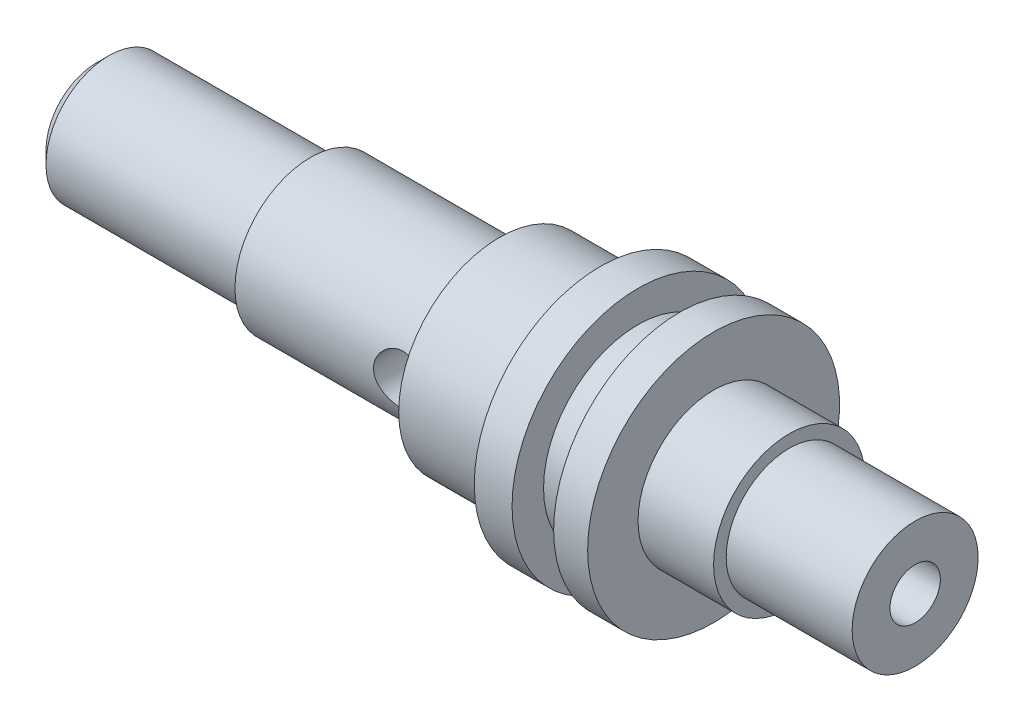
ISO-10303-21;
HEADER;
FILE_DESCRIPTION(('STEP AP214'),'2;1');
FILE_NAME('part.step','',(''),(''),'','','');
FILE_SCHEMA(('AUTOMOTIVE_DESIGN { 1 0 10303 214 1 1 1 1 }'));
ENDSEC;
DATA;
#1=APPLICATION_CONTEXT('core data for automotive mechanical design processes');
#2=APPLICATION_PROTOCOL_DEFINITION('international standard','automotive_design',2000,#1);
#3=PRODUCT_CONTEXT('',#1,'mechanical');
#4=PRODUCT('Part','Part','',(#3));
#5=PRODUCT_RELATED_PRODUCT_CATEGORY('part','',(#4));
#6=PRODUCT_DEFINITION_FORMATION('','',#4);
#7=PRODUCT_DEFINITION_CONTEXT('part definition',#1,'design');
#8=PRODUCT_DEFINITION('design','',#6,#7);
#9=PRODUCT_DEFINITION_SHAPE('','',#8);
#10=(LENGTH_UNIT() NAMED_UNIT(*) SI_UNIT(.MILLI.,.METRE.));
#11=(NAMED_UNIT(*) PLANE_ANGLE_UNIT() SI_UNIT($,.RADIAN.));
#12=(NAMED_UNIT(*) SI_UNIT($,.STERADIAN.) SOLID_ANGLE_UNIT());
#13=UNCERTAINTY_MEASURE_WITH_UNIT(LENGTH_MEASURE(1.E-05),#10,'distance_accuracy_value','');
#14=(GEOMETRIC_REPRESENTATION_CONTEXT(3) GLOBAL_UNCERTAINTY_ASSIGNED_CONTEXT((#13)) GLOBAL_UNIT_ASSIGNED_CONTEXT((#10,
#11,#12)) REPRESENTATION_CONTEXT('',''));
#15=CARTESIAN_POINT('',(0.,0.,0.));
#16=DIRECTION('',(0.,0.,1.));
#17=DIRECTION('',(1.,0.,0.));
#18=AXIS2_PLACEMENT_3D('',#15,#16,#17);
#19=CARTESIAN_POINT('',(0.,0.,0.));
#20=DIRECTION('',(1.,0.,0.));
#21=DIRECTION('',(0.,0.,-1.00000000000001));
#22=AXIS2_PLACEMENT_3D('',#19,#20,#21);
#23=PLANE('',#22);
#24=CARTESIAN_POINT('',(0.,0.,0.));
#25=DIRECTION('',(1.,0.,0.));
#26=DIRECTION('',(0.,0.,-1.00000000000001));
#27=AXIS2_PLACEMENT_3D('',#24,#25,#26);
#28=CIRCLE('',#27,4.);
#29=CARTESIAN_POINT('',(0.,0.,-4.00000000000003));
#30=VERTEX_POINT('',#29);
#31=EDGE_CURVE('E58',#30,#30,#28,.F.);
#32=ORIENTED_EDGE('',*,*,#31,.T.);
#33=EDGE_LOOP('',(#32));
#34=FACE_BOUND('',#33,.T.);
#35=ADVANCED_FACE('F50',(#34),#23,.F.);
#36=CARTESIAN_POINT('',(0.,0.,0.));
#37=DIRECTION('',(-1.,0.,0.));
#38=DIRECTION('',(0.,0.,1.00000000000001));
#39=AXIS2_PLACEMENT_3D('',#36,#37,#38);
#40=CYLINDRICAL_SURFACE('',#39,5.);
#41=CARTESIAN_POINT('',(1.00000000000001,0.,0.));
#42=DIRECTION('',(1.,0.,0.));
#43=DIRECTION('',(0.,0.,-1.00000000000001));
#44=AXIS2_PLACEMENT_3D('',#41,#42,#43);
#45=CIRCLE('',#44,5.);
#46=CARTESIAN_POINT('',(1.00000000000001,0.,-5.00000000000004));
#47=VERTEX_POINT('',#46);
#48=EDGE_CURVE('E13',#47,#47,#45,.T.);
#49=ORIENTED_EDGE('',*,*,#48,.T.);
#50=EDGE_LOOP('',(#49));
#51=FACE_BOUND('',#50,.T.);
#52=CARTESIAN_POINT('',(17.,0.,0.));
#53=DIRECTION('',(-1.,0.,0.));
#54=DIRECTION('',(0.,0.,1.00000000000001));
#55=AXIS2_PLACEMENT_3D('',#52,#53,#54);
#56=CIRCLE('',#55,5.);
#57=CARTESIAN_POINT('',(17.,0.,5.00000000000004));
#58=VERTEX_POINT('',#57);
#59=EDGE_CURVE('E92',#58,#58,#56,.T.);
#60=ORIENTED_EDGE('',*,*,#59,.T.);
#61=EDGE_LOOP('',(#60));
#62=FACE_BOUND('',#61,.T.);
#63=ADVANCED_FACE('F113',(#51,#62),#40,.T.);
#64=CARTESIAN_POINT('',(17.,5.00000000000003,0.));
#65=DIRECTION('',(1.,0.,0.));
#66=DIRECTION('',(0.,0.,-1.00000000000001));
#67=AXIS2_PLACEMENT_3D('',#64,#65,#66);
#68=PLANE('',#67);
#69=ORIENTED_EDGE('',*,*,#59,.F.);
#70=EDGE_LOOP('',(#69));
#71=FACE_BOUND('',#70,.T.);
#72=CARTESIAN_POINT('',(17.,0.,0.));
#73=DIRECTION('',(-1.,0.,0.));
#74=DIRECTION('',(0.,0.,1.00000000000001));
#75=AXIS2_PLACEMENT_3D('',#72,#73,#74);
#76=CIRCLE('',#75,6.);
#77=CARTESIAN_POINT('',(17.,0.,6.00000000000005));
#78=VERTEX_POINT('',#77);
#79=EDGE_CURVE('E220',#78,#78,#76,.T.);
#80=ORIENTED_EDGE('',*,*,#79,.T.);
#81=EDGE_LOOP('',(#80));
#82=FACE_BOUND('',#81,.T.);
#83=ADVANCED_FACE('F117',(#71,#82),#68,.F.);
#84=CARTESIAN_POINT('',(0.,0.,0.));
#85=DIRECTION('',(-1.,0.,0.));
#86=DIRECTION('',(0.,0.,1.00000000000001));
#87=AXIS2_PLACEMENT_3D('',#84,#85,#86);
#88=CYLINDRICAL_SURFACE('',#87,6.);
#89=ORIENTED_EDGE('',*,*,#79,.F.);
#90=EDGE_LOOP('',(#89));
#91=FACE_BOUND('',#90,.T.);
#92=CARTESIAN_POINT('',(32.,0.,0.));
#93=DIRECTION('',(-1.,0.,0.));
#94=DIRECTION('',(0.,0.,1.00000000000001));
#95=AXIS2_PLACEMENT_3D('',#92,#93,#94);
#96=CIRCLE('',#95,6.);
#97=CARTESIAN_POINT('',(32.,0.,-6.00000000000006));
#98=VERTEX_POINT('',#97);
#99=CARTESIAN_POINT('',(32.,0.,6.00000000000006));
#100=VERTEX_POINT('',#99);
#101=EDGE_CURVE('E210',#98,#100,#96,.T.);
#102=ORIENTED_EDGE('',*,*,#101,.T.);
#103=CARTESIAN_POINT('',(32.,0.,6.00000000000006));
#104=CARTESIAN_POINT('',(32.0000005074633,-0.109126725773445,6.00000030601894));
#105=CARTESIAN_POINT('',(31.9910394677456,-0.218250389077097,5.99699539015089));
#106=CARTESIAN_POINT('',(31.9555417823656,-0.433283521745945,5.98530420406561));
#107=CARTESIAN_POINT('',(31.9290033121022,-0.539192656237641,5.97661734404311));
#108=CARTESIAN_POINT('',(31.8593615132319,-0.744665579003556,5.95450615812891));
#109=CARTESIAN_POINT('',(31.8162858750815,-0.844239651772065,5.94108975461707));
#110=CARTESIAN_POINT('',(31.7149176543233,-1.03474987361065,5.91088891434683));
#111=CARTESIAN_POINT('',(31.6566220699948,-1.12568431391742,5.89410381335562));
#112=CARTESIAN_POINT('',(31.5243483902825,-1.29948335004454,5.85828188886017));
#113=CARTESIAN_POINT('',(31.449937531479,-1.38200740059662,5.83919112927571));
#114=CARTESIAN_POINT('',(31.2884656905869,-1.53366538540417,5.80120629566242));
#115=CARTESIAN_POINT('',(31.201401930143,-1.60279637097894,5.78231226581101));
#116=CARTESIAN_POINT('',(31.0140297696071,-1.72764988445573,5.74626664954551));
#117=CARTESIAN_POINT('',(30.9134125205358,-1.78292971644207,5.72918078551376));
#118=CARTESIAN_POINT('',(30.7036478110829,-1.87563774775545,5.69950610837202));
#119=CARTESIAN_POINT('',(30.5945029656745,-1.91307139477355,5.68691592321494));
#120=CARTESIAN_POINT('',(30.3746535570066,-1.96774692301834,5.66822606538757));
#121=CARTESIAN_POINT('',(30.2641255830219,-1.98562689654354,5.66192191539222));
#122=CARTESIAN_POINT('',(30.0414724916882,-2.00268224666896,5.65591313259015));
#123=CARTESIAN_POINT('',(29.9293478785816,-2.00186340320946,5.65620646045463));
#124=CARTESIAN_POINT('',(29.712126739112,-1.98203980740686,5.66318030016363));
#125=CARTESIAN_POINT('',(29.606943194162,-1.96386782633399,5.66956831735066));
#126=CARTESIAN_POINT('',(29.4012131607863,-1.91121232569884,5.68753315449102));
#127=CARTESIAN_POINT('',(29.3006672291299,-1.87672685318376,5.69911059568218));
#128=CARTESIAN_POINT('',(29.105174500817,-1.79187811612044,5.72635822262501));
#129=CARTESIAN_POINT('',(29.0103439490609,-1.74126809741453,5.74209131586234));
#130=CARTESIAN_POINT('',(28.8302581834405,-1.62577821260628,5.77585117151453));
#131=CARTESIAN_POINT('',(28.7450057461332,-1.56089422472803,5.7938785958093));
#132=CARTESIAN_POINT('',(28.5818168036784,-1.41469866536449,5.83134658335485));
#133=CARTESIAN_POINT('',(28.5044946109819,-1.33270630015263,5.85081178709685));
#134=CARTESIAN_POINT('',(28.3645374666732,-1.15667913994013,5.88813876774074));
#135=CARTESIAN_POINT('',(28.301903923671,-1.06264319132164,5.90600039076141));
#136=CARTESIAN_POINT('',(28.1926073995299,-0.863895226092548,5.93834215875593));
#137=CARTESIAN_POINT('',(28.1461090173185,-0.759086552832677,5.95278700016078));
#138=CARTESIAN_POINT('',(28.0715936520886,-0.542538166729014,5.9764113428887));
#139=CARTESIAN_POINT('',(28.0435702491531,-0.43080087630991,5.98559267309765));
#140=CARTESIAN_POINT('',(28.0078886679553,-0.208767659058613,5.99735254142887));
#141=CARTESIAN_POINT('',(27.9994003816545,-0.0986191997296962,6.00020003667456));
#142=CARTESIAN_POINT('',(28.0006653471969,0.121550139920475,5.99977805389655));
#143=CARTESIAN_POINT('',(28.0104155199597,0.231571038639303,5.99650960838731));
#144=CARTESIAN_POINT('',(28.0472238154719,0.445039732608511,5.98440049434215));
#145=CARTESIAN_POINT('',(28.073772412099,0.548585613669682,5.97572397422385));
#146=CARTESIAN_POINT('',(28.1427868889335,0.749711917159147,5.9538369366014));
#147=CARTESIAN_POINT('',(28.1852547989356,0.847291577017221,5.94062584093356));
#148=CARTESIAN_POINT('',(28.2861408636816,1.03657659278655,5.91057862574586));
#149=CARTESIAN_POINT('',(28.3449491865663,1.12805991843429,5.89365629511573));
#150=CARTESIAN_POINT('',(28.476388300027,1.30012966027117,5.85810507832524));
#151=CARTESIAN_POINT('',(28.5490233120635,1.38071273559116,5.83947567187658));
#152=CARTESIAN_POINT('',(28.7099575020132,1.53250501561261,5.80153695960893));
#153=CARTESIAN_POINT('',(28.7988184538537,1.60312193849154,5.78223522174856));
#154=CARTESIAN_POINT('',(28.9875431356218,1.72851504464715,5.74599946589417));
#155=CARTESIAN_POINT('',(29.0874069572681,1.78329109586204,5.72906546764008));
#156=CARTESIAN_POINT('',(29.2953460305798,1.87519386083274,5.6996478358277));
#157=CARTESIAN_POINT('',(29.4034041583375,1.91235626433004,5.68715521585957));
#158=CARTESIAN_POINT('',(29.6247573000883,1.96778933351871,5.66821664612899));
#159=CARTESIAN_POINT('',(29.7380499308087,1.9860685099079,5.66176797247282));
#160=CARTESIAN_POINT('',(29.9603941920818,2.0025525649547,5.65595717748357));
#161=CARTESIAN_POINT('',(30.0693646805736,2.0017405146168,5.6562480051483));
#162=CARTESIAN_POINT('',(30.2855301498441,1.98248458689739,5.66302539647735));
#163=CARTESIAN_POINT('',(30.3927252359102,1.96404175891719,5.66951159138726));
#164=CARTESIAN_POINT('',(30.6002713260049,1.91074362625871,5.68769048609786));
#165=CARTESIAN_POINT('',(30.700713650009,1.87620669203103,5.69928196044955));
#166=CARTESIAN_POINT('',(30.8944548138765,1.7919587315195,5.72632797636937));
#167=CARTESIAN_POINT('',(30.987752062376,1.74224433710763,5.74178337526789));
#168=CARTESIAN_POINT('',(31.1689673398458,1.62652138516688,5.77565658452095));
#169=CARTESIAN_POINT('',(31.2564730037968,1.55989648552917,5.79417423284273));
#170=CARTESIAN_POINT('',(31.4193796267684,1.4132857662713,5.83166712566506));
#171=CARTESIAN_POINT('',(31.4947771513761,1.33329616890298,5.85064249824751));
#172=CARTESIAN_POINT('',(31.6342888245784,1.15848311384139,5.88780061051094));
#173=CARTESIAN_POINT('',(31.697848695502,1.06320302699946,5.90592363602513));
#174=CARTESIAN_POINT('',(31.8079808577013,0.862714714813247,5.93851982345224));
#175=CARTESIAN_POINT('',(31.8545574918441,0.757509036264702,5.95299391815866));
#176=CARTESIAN_POINT('',(31.9274432649773,0.544987294401957,5.9761103013709));
#177=CARTESIAN_POINT('',(31.9545649325268,0.437975515352818,5.98498424845045));
#178=CARTESIAN_POINT('',(31.9908405613543,0.220640832020491,5.99692814128444));
#179=CARTESIAN_POINT('',(31.9999994869931,0.110318851137491,5.99999969063816));
#180=CARTESIAN_POINT('',(32.,0.,6.00000000000006));
#181=B_SPLINE_CURVE_WITH_KNOTS('',3,(#103,#104,#105,#106,#107,#108,#109,#110,#111,#112,#113,
#114,#115,#116,#117,#118,#119,#120,#121,#122,#123,#124,#125,#126,#127,#128,#129,#130,#131,#132,
#133,#134,#135,#136,#137,#138,#139,#140,#141,#142,#143,#144,#145,#146,#147,#148,#149,#150,#151,
#152,#153,#154,#155,#156,#157,#158,#159,#160,#161,#162,#163,#164,#165,#166,#167,#168,#169,#170,
#171,#172,#173,#174,#175,#176,#177,#178,#179,#180),.UNSPECIFIED.,.T.,.F.,(4,2,2,2,2,2,2,2,2,2,2,
2,2,2,2,2,2,2,2,2,2,2,2,2,2,2,2,2,2,2,2,2,2,2,2,2,2,2,4),(0.,0.326974212052022,
0.653982370535042,0.980445345740551,1.3069727555982,1.64369368565513,1.98048866575062,
2.32696769646942,2.67334089385668,3.00803851483682,3.34263267974972,3.66193653102562,
3.98127861710965,4.30576342310263,4.63034205116416,4.97186611622736,5.31342291933239,
5.65836811300718,6.00319337754419,6.33307166350342,6.66289426328356,6.9831631595643,
7.30347290568211,7.63220799687476,7.96104361643786,8.30482045761508,8.64860016469997,
8.99168027653545,9.33460569411684,9.65991332128521,9.98520158702754,10.3043117416084,
10.6234927635196,10.9566013338361,11.2898042224756,11.6359932167021,11.9820936230492,
12.3127311674763,12.6432773207629),.UNSPECIFIED.);
#182=EDGE_CURVE('E133',#100,#100,#181,.T.);
#183=ORIENTED_EDGE('',*,*,#182,.T.);
#184=EDGE_CURVE('E217',#100,#98,#96,.T.);
#185=ORIENTED_EDGE('',*,*,#184,.T.);
#186=CARTESIAN_POINT('',(32.,0.,-6.00000000000006));
#187=CARTESIAN_POINT('',(32.0000005074633,0.109126725773445,-6.00000030601894));
#188=CARTESIAN_POINT('',(31.9910394677456,0.218250389077097,-5.99699539015089));
#189=CARTESIAN_POINT('',(31.9555417823656,0.433283521745945,-5.98530420406561));
#190=CARTESIAN_POINT('',(31.9290033121022,0.539192656237641,-5.97661734404311));
#191=CARTESIAN_POINT('',(31.8593615132319,0.744665579003556,-5.95450615812891));
#192=CARTESIAN_POINT('',(31.8162858750815,0.844239651772065,-5.94108975461707));
#193=CARTESIAN_POINT('',(31.7149176543233,1.03474987361065,-5.91088891434683));
#194=CARTESIAN_POINT('',(31.6566220699948,1.12568431391742,-5.89410381335562));
#195=CARTESIAN_POINT('',(31.5243483902825,1.29948335004454,-5.85828188886017));
#196=CARTESIAN_POINT('',(31.449937531479,1.38200740059662,-5.83919112927571));
#197=CARTESIAN_POINT('',(31.2884656905869,1.53366538540417,-5.80120629566242));
#198=CARTESIAN_POINT('',(31.201401930143,1.60279637097894,-5.78231226581101));
#199=CARTESIAN_POINT('',(31.0140297696071,1.72764988445573,-5.74626664954551));
#200=CARTESIAN_POINT('',(30.9134125205358,1.78292971644207,-5.72918078551376));
#201=CARTESIAN_POINT('',(30.7036478110829,1.87563774775545,-5.69950610837202));
#202=CARTESIAN_POINT('',(30.5945029656745,1.91307139477355,-5.68691592321494));
#203=CARTESIAN_POINT('',(30.3746535570066,1.96774692301834,-5.66822606538757));
#204=CARTESIAN_POINT('',(30.2641255830219,1.98562689654354,-5.66192191539222));
#205=CARTESIAN_POINT('',(30.0414724916882,2.00268224666896,-5.65591313259015));
#206=CARTESIAN_POINT('',(29.9293478785816,2.00186340320946,-5.65620646045463));
#207=CARTESIAN_POINT('',(29.712126739112,1.98203980740686,-5.66318030016363));
#208=CARTESIAN_POINT('',(29.606943194162,1.96386782633399,-5.66956831735066));
#209=CARTESIAN_POINT('',(29.4012131607863,1.91121232569884,-5.68753315449102));
#210=CARTESIAN_POINT('',(29.3006672291299,1.87672685318376,-5.69911059568218));
#211=CARTESIAN_POINT('',(29.105174500817,1.79187811612044,-5.72635822262501));
#212=CARTESIAN_POINT('',(29.0103439490609,1.74126809741453,-5.74209131586234));
#213=CARTESIAN_POINT('',(28.8302581834405,1.62577821260628,-5.77585117151453));
#214=CARTESIAN_POINT('',(28.7450057461332,1.56089422472803,-5.7938785958093));
#215=CARTESIAN_POINT('',(28.5818168036784,1.41469866536449,-5.83134658335485));
#216=CARTESIAN_POINT('',(28.5044946109819,1.33270630015263,-5.85081178709685));
#217=CARTESIAN_POINT('',(28.3645374666732,1.15667913994013,-5.88813876774074));
#218=CARTESIAN_POINT('',(28.301903923671,1.06264319132164,-5.90600039076141));
#219=CARTESIAN_POINT('',(28.1926073995299,0.863895226092548,-5.93834215875593));
#220=CARTESIAN_POINT('',(28.1461090173185,0.759086552832677,-5.95278700016078));
#221=CARTESIAN_POINT('',(28.0715936520886,0.542538166729014,-5.9764113428887));
#222=CARTESIAN_POINT('',(28.0435702491531,0.43080087630991,-5.98559267309765));
#223=CARTESIAN_POINT('',(28.0078886679553,0.208767659058613,-5.99735254142887));
#224=CARTESIAN_POINT('',(27.9994003816545,0.0986191997296962,-6.00020003667456));
#225=CARTESIAN_POINT('',(28.0006653471969,-0.121550139920475,-5.99977805389655));
#226=CARTESIAN_POINT('',(28.0104155199597,-0.231571038639303,-5.99650960838731));
#227=CARTESIAN_POINT('',(28.0472238154719,-0.445039732608511,-5.98440049434215));
#228=CARTESIAN_POINT('',(28.073772412099,-0.548585613669682,-5.97572397422385));
#229=CARTESIAN_POINT('',(28.1427868889335,-0.749711917159147,-5.9538369366014));
#230=CARTESIAN_POINT('',(28.1852547989356,-0.847291577017221,-5.94062584093356));
#231=CARTESIAN_POINT('',(28.2861408636816,-1.03657659278655,-5.91057862574586));
#232=CARTESIAN_POINT('',(28.3449491865663,-1.12805991843429,-5.89365629511573));
#233=CARTESIAN_POINT('',(28.476388300027,-1.30012966027117,-5.85810507832524));
#234=CARTESIAN_POINT('',(28.5490233120635,-1.38071273559116,-5.83947567187658));
#235=CARTESIAN_POINT('',(28.7099575020132,-1.53250501561261,-5.80153695960893));
#236=CARTESIAN_POINT('',(28.7988184538537,-1.60312193849154,-5.78223522174856));
#237=CARTESIAN_POINT('',(28.9875431356218,-1.72851504464715,-5.74599946589417));
#238=CARTESIAN_POINT('',(29.0874069572681,-1.78329109586204,-5.72906546764008));
#239=CARTESIAN_POINT('',(29.2953460305798,-1.87519386083274,-5.6996478358277));
#240=CARTESIAN_POINT('',(29.4034041583375,-1.91235626433004,-5.68715521585957));
#241=CARTESIAN_POINT('',(29.6247573000883,-1.96778933351871,-5.66821664612899));
#242=CARTESIAN_POINT('',(29.7380499308087,-1.9860685099079,-5.66176797247282));
#243=CARTESIAN_POINT('',(29.9603941920818,-2.0025525649547,-5.65595717748357));
#244=CARTESIAN_POINT('',(30.0693646805736,-2.0017405146168,-5.6562480051483));
#245=CARTESIAN_POINT('',(30.2855301498441,-1.98248458689739,-5.66302539647735));
#246=CARTESIAN_POINT('',(30.3927252359102,-1.96404175891719,-5.66951159138726));
#247=CARTESIAN_POINT('',(30.6002713260049,-1.91074362625871,-5.68769048609786));
#248=CARTESIAN_POINT('',(30.700713650009,-1.87620669203103,-5.69928196044955));
#249=CARTESIAN_POINT('',(30.8944548138765,-1.7919587315195,-5.72632797636937));
#250=CARTESIAN_POINT('',(30.987752062376,-1.74224433710763,-5.74178337526789));
#251=CARTESIAN_POINT('',(31.1689673398458,-1.62652138516688,-5.77565658452095));
#252=CARTESIAN_POINT('',(31.2564730037968,-1.55989648552917,-5.79417423284273));
#253=CARTESIAN_POINT('',(31.4193796267684,-1.4132857662713,-5.83166712566506));
#254=CARTESIAN_POINT('',(31.4947771513761,-1.33329616890298,-5.85064249824751));
#255=CARTESIAN_POINT('',(31.6342888245784,-1.15848311384139,-5.88780061051094));
#256=CARTESIAN_POINT('',(31.697848695502,-1.06320302699946,-5.90592363602513));
#257=CARTESIAN_POINT('',(31.8079808577013,-0.862714714813247,-5.93851982345224));
#258=CARTESIAN_POINT('',(31.8545574918441,-0.757509036264702,-5.95299391815866));
#259=CARTESIAN_POINT('',(31.9274432649773,-0.544987294401957,-5.9761103013709));
#260=CARTESIAN_POINT('',(31.9545649325268,-0.437975515352818,-5.98498424845045));
#261=CARTESIAN_POINT('',(31.9908405613543,-0.220640832020491,-5.99692814128444));
#262=CARTESIAN_POINT('',(31.9999994869931,-0.110318851137491,-5.99999969063816));
#263=CARTESIAN_POINT('',(32.,0.,-6.00000000000006));
#264=B_SPLINE_CURVE_WITH_KNOTS('',3,(#186,#187,#188,#189,#190,#191,#192,#193,#194,#195,#196,
#197,#198,#199,#200,#201,#202,#203,#204,#205,#206,#207,#208,#209,#210,#211,#212,#213,#214,#215,
#216,#217,#218,#219,#220,#221,#222,#223,#224,#225,#226,#227,#228,#229,#230,#231,#232,#233,#234,
#235,#236,#237,#238,#239,#240,#241,#242,#243,#244,#245,#246,#247,#248,#249,#250,#251,#252,#253,
#254,#255,#256,#257,#258,#259,#260,#261,#262,#263),.UNSPECIFIED.,.T.,.F.,(4,2,2,2,2,2,2,2,2,2,2,
2,2,2,2,2,2,2,2,2,2,2,2,2,2,2,2,2,2,2,2,2,2,2,2,2,2,2,4),(0.,0.326974212052022,
0.653982370535042,0.980445345740551,1.3069727555982,1.64369368565513,1.98048866575062,
2.32696769646942,2.67334089385668,3.00803851483682,3.34263267974972,3.66193653102562,
3.98127861710965,4.30576342310263,4.63034205116416,4.97186611622736,5.31342291933239,
5.65836811300718,6.00319337754419,6.33307166350342,6.66289426328356,6.9831631595643,
7.30347290568211,7.63220799687476,7.96104361643786,8.30482045761508,8.64860016469997,
8.99168027653545,9.33460569411684,9.65991332128521,9.98520158702754,10.3043117416084,
10.6234927635196,10.9566013338361,11.2898042224756,11.6359932167021,11.9820936230492,
12.3127311674763,12.6432773207629),.UNSPECIFIED.);
#265=EDGE_CURVE('E70',#98,#98,#264,.T.);
#266=ORIENTED_EDGE('',*,*,#265,.T.);
#267=EDGE_LOOP('',(#102,#183,#185,#266));
#268=FACE_BOUND('',#267,.T.);
#269=ADVANCED_FACE('F123',(#91,#268),#88,.T.);
#270=CARTESIAN_POINT('',(32.,6.00000000000006,0.));
#271=DIRECTION('',(1.,0.,0.));
#272=DIRECTION('',(0.,0.,-1.00000000000001));
#273=AXIS2_PLACEMENT_3D('',#270,#271,#272);
#274=PLANE('',#273);
#275=ORIENTED_EDGE('',*,*,#101,.F.);
#276=ORIENTED_EDGE('',*,*,#184,.F.);
#277=EDGE_LOOP('',(#275,#276));
#278=FACE_BOUND('',#277,.T.);
#279=CARTESIAN_POINT('',(32.,0.,0.));
#280=DIRECTION('',(-1.,0.,0.));
#281=DIRECTION('',(0.,0.,1.00000000000001));
#282=AXIS2_PLACEMENT_3D('',#279,#280,#281);
#283=CIRCLE('',#282,8.);
#284=CARTESIAN_POINT('',(32.,0.,8.00000000000006));
#285=VERTEX_POINT('',#284);
#286=EDGE_CURVE('E204',#285,#285,#283,.T.);
#287=ORIENTED_EDGE('',*,*,#286,.T.);
#288=EDGE_LOOP('',(#287));
#289=FACE_BOUND('',#288,.T.);
#290=ADVANCED_FACE('F128',(#278,#289),#274,.F.);
#291=CARTESIAN_POINT('',(0.,0.,0.));
#292=DIRECTION('',(-1.,0.,0.));
#293=DIRECTION('',(0.,0.,1.00000000000001));
#294=AXIS2_PLACEMENT_3D('',#291,#292,#293);
#295=CYLINDRICAL_SURFACE('',#294,8.);
#296=ORIENTED_EDGE('',*,*,#286,.F.);
#297=EDGE_LOOP('',(#296));
#298=FACE_BOUND('',#297,.T.);
#299=CARTESIAN_POINT('',(40.,0.,0.));
#300=DIRECTION('',(-1.,0.,0.));
#301=DIRECTION('',(0.,0.,1.00000000000001));
#302=AXIS2_PLACEMENT_3D('',#299,#300,#301);
#303=CIRCLE('',#302,8.);
#304=CARTESIAN_POINT('',(40.,0.,8.00000000000006));
#305=VERTEX_POINT('',#304);
#306=EDGE_CURVE('E207',#305,#305,#303,.T.);
#307=ORIENTED_EDGE('',*,*,#306,.T.);
#308=EDGE_LOOP('',(#307));
#309=FACE_BOUND('',#308,.T.);
#310=ADVANCED_FACE('F193',(#298,#309),#295,.T.);
#311=CARTESIAN_POINT('',(40.,8.00000000000006,0.));
#312=DIRECTION('',(1.,0.,0.));
#313=DIRECTION('',(0.,0.,-1.00000000000001));
#314=AXIS2_PLACEMENT_3D('',#311,#312,#313);
#315=PLANE('',#314);
#316=ORIENTED_EDGE('',*,*,#306,.F.);
#317=EDGE_LOOP('',(#316));
#318=FACE_BOUND('',#317,.T.);
#319=CARTESIAN_POINT('',(40.,0.,0.));
#320=DIRECTION('',(-1.,0.,0.));
#321=DIRECTION('',(0.,0.,1.00000000000001));
#322=AXIS2_PLACEMENT_3D('',#319,#320,#321);
#323=CIRCLE('',#322,10.);
#324=CARTESIAN_POINT('',(40.,0.,10.0000000000001));
#325=VERTEX_POINT('',#324);
#326=EDGE_CURVE('E208',#325,#325,#323,.T.);
#327=ORIENTED_EDGE('',*,*,#326,.T.);
#328=EDGE_LOOP('',(#327));
#329=FACE_BOUND('',#328,.T.);
#330=ADVANCED_FACE('F190',(#318,#329),#315,.F.);
#331=CARTESIAN_POINT('',(0.,0.,0.));
#332=DIRECTION('',(-1.,0.,0.));
#333=DIRECTION('',(0.,0.,1.00000000000001));
#334=AXIS2_PLACEMENT_3D('',#331,#332,#333);
#335=CYLINDRICAL_SURFACE('',#334,10.);
#336=ORIENTED_EDGE('',*,*,#326,.F.);
#337=EDGE_LOOP('',(#336));
#338=FACE_BOUND('',#337,.T.);
#339=CARTESIAN_POINT('',(43.,0.,0.));
#340=DIRECTION('',(-1.,0.,0.));
#341=DIRECTION('',(0.,0.,1.00000000000001));
#342=AXIS2_PLACEMENT_3D('',#339,#340,#341);
#343=CIRCLE('',#342,10.);
#344=CARTESIAN_POINT('',(43.,0.,10.0000000000001));
#345=VERTEX_POINT('',#344);
#346=EDGE_CURVE('E213',#345,#345,#343,.T.);
#347=ORIENTED_EDGE('',*,*,#346,.T.);
#348=EDGE_LOOP('',(#347));
#349=FACE_BOUND('',#348,.T.);
#350=ADVANCED_FACE('F186',(#338,#349),#335,.T.);
#351=CARTESIAN_POINT('',(43.,10.0000000000001,0.));
#352=DIRECTION('',(-1.,0.,0.));
#353=DIRECTION('',(0.,0.,1.00000000000001));
#354=AXIS2_PLACEMENT_3D('',#351,#352,#353);
#355=PLANE('',#354);
#356=ORIENTED_EDGE('',*,*,#346,.F.);
#357=EDGE_LOOP('',(#356));
#358=FACE_BOUND('',#357,.T.);
#359=CARTESIAN_POINT('',(43.,0.,0.));
#360=DIRECTION('',(-1.,0.,0.));
#361=DIRECTION('',(0.,0.,1.00000000000001));
#362=AXIS2_PLACEMENT_3D('',#359,#360,#361);
#363=CIRCLE('',#362,7.5);
#364=CARTESIAN_POINT('',(43.,0.,7.50000000000006));
#365=VERTEX_POINT('',#364);
#366=EDGE_CURVE('E327',#365,#365,#363,.T.);
#367=ORIENTED_EDGE('',*,*,#366,.T.);
#368=EDGE_LOOP('',(#367));
#369=FACE_BOUND('',#368,.T.);
#370=ADVANCED_FACE('F182',(#358,#369),#355,.F.);
#371=CARTESIAN_POINT('',(0.,0.,0.));
#372=DIRECTION('',(-1.,0.,0.));
#373=DIRECTION('',(0.,0.,1.00000000000001));
#374=AXIS2_PLACEMENT_3D('',#371,#372,#373);
#375=CYLINDRICAL_SURFACE('',#374,7.5);
#376=ORIENTED_EDGE('',*,*,#366,.F.);
#377=EDGE_LOOP('',(#376));
#378=FACE_BOUND('',#377,.T.);
#379=CARTESIAN_POINT('',(46.3,0.,0.));
#380=DIRECTION('',(-1.,0.,0.));
#381=DIRECTION('',(0.,0.,1.00000000000001));
#382=AXIS2_PLACEMENT_3D('',#379,#380,#381);
#383=CIRCLE('',#382,7.5);
#384=CARTESIAN_POINT('',(46.3,0.,7.50000000000006));
#385=VERTEX_POINT('',#384);
#386=EDGE_CURVE('E330',#385,#385,#383,.T.);
#387=ORIENTED_EDGE('',*,*,#386,.T.);
#388=EDGE_LOOP('',(#387));
#389=FACE_BOUND('',#388,.T.);
#390=ADVANCED_FACE('F178',(#378,#389),#375,.T.);
#391=CARTESIAN_POINT('',(46.3,7.50000000000006,0.));
#392=DIRECTION('',(1.,0.,0.));
#393=DIRECTION('',(0.,0.,-1.00000000000001));
#394=AXIS2_PLACEMENT_3D('',#391,#392,#393);
#395=PLANE('',#394);
#396=ORIENTED_EDGE('',*,*,#386,.F.);
#397=EDGE_LOOP('',(#396));
#398=FACE_BOUND('',#397,.T.);
#399=CARTESIAN_POINT('',(46.3,0.,0.));
#400=DIRECTION('',(-1.,0.,0.));
#401=DIRECTION('',(0.,0.,1.00000000000001));
#402=AXIS2_PLACEMENT_3D('',#399,#400,#401);
#403=CIRCLE('',#402,10.);
#404=CARTESIAN_POINT('',(46.3,0.,10.0000000000001));
#405=VERTEX_POINT('',#404);
#406=EDGE_CURVE('E333',#405,#405,#403,.T.);
#407=ORIENTED_EDGE('',*,*,#406,.T.);
#408=EDGE_LOOP('',(#407));
#409=FACE_BOUND('',#408,.T.);
#410=ADVANCED_FACE('F174',(#398,#409),#395,.F.);
#411=CARTESIAN_POINT('',(0.,0.,0.));
#412=DIRECTION('',(-1.,0.,0.));
#413=DIRECTION('',(0.,0.,1.00000000000001));
#414=AXIS2_PLACEMENT_3D('',#411,#412,#413);
#415=CYLINDRICAL_SURFACE('',#414,10.);
#416=ORIENTED_EDGE('',*,*,#406,.F.);
#417=EDGE_LOOP('',(#416));
#418=FACE_BOUND('',#417,.T.);
#419=CARTESIAN_POINT('',(49.,0.,0.));
#420=DIRECTION('',(-1.,0.,0.));
#421=DIRECTION('',(0.,0.,1.00000000000001));
#422=AXIS2_PLACEMENT_3D('',#419,#420,#421);
#423=CIRCLE('',#422,10.);
#424=CARTESIAN_POINT('',(49.,0.,10.0000000000001));
#425=VERTEX_POINT('',#424);
#426=EDGE_CURVE('E336',#425,#425,#423,.T.);
#427=ORIENTED_EDGE('',*,*,#426,.T.);
#428=EDGE_LOOP('',(#427));
#429=FACE_BOUND('',#428,.T.);
#430=ADVANCED_FACE('F170',(#418,#429),#415,.T.);
#431=CARTESIAN_POINT('',(49.,10.0000000000001,0.));
#432=DIRECTION('',(-1.,0.,0.));
#433=DIRECTION('',(0.,0.,1.00000000000001));
#434=AXIS2_PLACEMENT_3D('',#431,#432,#433);
#435=PLANE('',#434);
#436=ORIENTED_EDGE('',*,*,#426,.F.);
#437=EDGE_LOOP('',(#436));
#438=FACE_BOUND('',#437,.T.);
#439=CARTESIAN_POINT('',(49.,0.,0.));
#440=DIRECTION('',(-1.,0.,0.));
#441=DIRECTION('',(0.,0.,1.00000000000001));
#442=AXIS2_PLACEMENT_3D('',#439,#440,#441);
#443=CIRCLE('',#442,6.);
#444=CARTESIAN_POINT('',(49.,0.,6.00000000000005));
#445=VERTEX_POINT('',#444);
#446=EDGE_CURVE('E339',#445,#445,#443,.T.);
#447=ORIENTED_EDGE('',*,*,#446,.T.);
#448=EDGE_LOOP('',(#447));
#449=FACE_BOUND('',#448,.T.);
#450=ADVANCED_FACE('F166',(#438,#449),#435,.F.);
#451=CARTESIAN_POINT('',(0.,0.,0.));
#452=DIRECTION('',(-1.,0.,0.));
#453=DIRECTION('',(0.,0.,1.00000000000001));
#454=AXIS2_PLACEMENT_3D('',#451,#452,#453);
#455=CYLINDRICAL_SURFACE('',#454,6.);
#456=ORIENTED_EDGE('',*,*,#446,.F.);
#457=EDGE_LOOP('',(#456));
#458=FACE_BOUND('',#457,.T.);
#459=CARTESIAN_POINT('',(55.,0.,0.));
#460=DIRECTION('',(-1.,0.,0.));
#461=DIRECTION('',(0.,0.,1.00000000000001));
#462=AXIS2_PLACEMENT_3D('',#459,#460,#461);
#463=CIRCLE('',#462,6.);
#464=CARTESIAN_POINT('',(55.,0.,6.00000000000005));
#465=VERTEX_POINT('',#464);
#466=EDGE_CURVE('E342',#465,#465,#463,.T.);
#467=ORIENTED_EDGE('',*,*,#466,.T.);
#468=EDGE_LOOP('',(#467));
#469=FACE_BOUND('',#468,.T.);
#470=ADVANCED_FACE('F162',(#458,#469),#455,.T.);
#471=CARTESIAN_POINT('',(55.,6.00000000000006,0.));
#472=DIRECTION('',(-1.,0.,0.));
#473=DIRECTION('',(0.,0.,1.00000000000001));
#474=AXIS2_PLACEMENT_3D('',#471,#472,#473);
#475=PLANE('',#474);
#476=ORIENTED_EDGE('',*,*,#466,.F.);
#477=EDGE_LOOP('',(#476));
#478=FACE_BOUND('',#477,.T.);
#479=CARTESIAN_POINT('',(55.,0.,0.));
#480=DIRECTION('',(-1.,0.,0.));
#481=DIRECTION('',(0.,0.,1.00000000000001));
#482=AXIS2_PLACEMENT_3D('',#479,#480,#481);
#483=CIRCLE('',#482,5.);
#484=CARTESIAN_POINT('',(55.,0.,5.00000000000004));
#485=VERTEX_POINT('',#484);
#486=EDGE_CURVE('E345',#485,#485,#483,.T.);
#487=ORIENTED_EDGE('',*,*,#486,.T.);
#488=EDGE_LOOP('',(#487));
#489=FACE_BOUND('',#488,.T.);
#490=ADVANCED_FACE('F158',(#478,#489),#475,.F.);
#491=CARTESIAN_POINT('',(0.,0.,0.));
#492=DIRECTION('',(-1.,0.,0.));
#493=DIRECTION('',(0.,0.,1.00000000000001));
#494=AXIS2_PLACEMENT_3D('',#491,#492,#493);
#495=CYLINDRICAL_SURFACE('',#494,5.);
#496=ORIENTED_EDGE('',*,*,#486,.F.);
#497=EDGE_LOOP('',(#496));
#498=FACE_BOUND('',#497,.T.);
#499=CARTESIAN_POINT('',(65.,0.,0.));
#500=DIRECTION('',(-1.,0.,0.));
#501=DIRECTION('',(0.,0.,1.00000000000001));
#502=AXIS2_PLACEMENT_3D('',#499,#500,#501);
#503=CIRCLE('',#502,5.);
#504=CARTESIAN_POINT('',(65.,0.,5.00000000000004));
#505=VERTEX_POINT('',#504);
#506=EDGE_CURVE('E348',#505,#505,#503,.T.);
#507=ORIENTED_EDGE('',*,*,#506,.T.);
#508=EDGE_LOOP('',(#507));
#509=FACE_BOUND('',#508,.T.);
#510=ADVANCED_FACE('F154',(#498,#509),#495,.T.);
#511=CARTESIAN_POINT('',(65.,5.00000000000003,0.));
#512=DIRECTION('',(-1.,0.,0.));
#513=DIRECTION('',(0.,0.,1.00000000000001));
#514=AXIS2_PLACEMENT_3D('',#511,#512,#513);
#515=PLANE('',#514);
#516=ORIENTED_EDGE('',*,*,#506,.F.);
#517=EDGE_LOOP('',(#516));
#518=FACE_BOUND('',#517,.T.);
#519=CARTESIAN_POINT('',(65.,0.,0.));
#520=DIRECTION('',(-1.,0.,0.));
#521=DIRECTION('',(0.,0.,1.00000000000001));
#522=AXIS2_PLACEMENT_3D('',#519,#520,#521);
#523=CIRCLE('',#522,2.);
#524=CARTESIAN_POINT('',(65.,0.,2.00000000000002));
#525=VERTEX_POINT('',#524);
#526=EDGE_CURVE('E350',#525,#525,#523,.T.);
#527=ORIENTED_EDGE('',*,*,#526,.T.);
#528=EDGE_LOOP('',(#527));
#529=FACE_BOUND('',#528,.T.);
#530=ADVANCED_FACE('F151',(#518,#529),#515,.F.);
#531=CARTESIAN_POINT('',(0.,0.,0.));
#532=DIRECTION('',(-1.,0.,0.));
#533=DIRECTION('',(0.,0.,1.00000000000001));
#534=AXIS2_PLACEMENT_3D('',#531,#532,#533);
#535=CYLINDRICAL_SURFACE('',#534,2.);
#536=CARTESIAN_POINT('',(30.,0.,0.));
#537=DIRECTION('',(-0.707106781186547,0.,-0.707106781186551));
#538=DIRECTION('',(-0.707106781186547,0.,0.707106781186551));
#539=AXIS2_PLACEMENT_3D('',#536,#537,#538);
#540=ELLIPSE('',#539,2.82842712474619,2.);
#541=CARTESIAN_POINT('',(30.,2.00000000000002,0.));
#542=VERTEX_POINT('',#541);
#543=CARTESIAN_POINT('',(30.,-2.00000000000002,0.));
#544=VERTEX_POINT('',#543);
#545=EDGE_CURVE('E82',#542,#544,#540,.T.);
#546=ORIENTED_EDGE('',*,*,#545,.T.);
#547=CARTESIAN_POINT('',(30.,0.,0.));
#548=DIRECTION('',(-0.707106781186547,0.,0.707106781186551));
#549=DIRECTION('',(-0.707106781186547,0.,-0.707106781186551));
#550=AXIS2_PLACEMENT_3D('',#547,#548,#549);
#551=ELLIPSE('',#550,2.82842712474619,2.);
#552=EDGE_CURVE('E87',#544,#542,#551,.T.);
#553=ORIENTED_EDGE('',*,*,#552,.T.);
#554=EDGE_LOOP('',(#546,#553));
#555=FACE_BOUND('',#554,.T.);
#556=ORIENTED_EDGE('',*,*,#526,.F.);
#557=EDGE_LOOP('',(#556));
#558=FACE_BOUND('',#557,.T.);
#559=ADVANCED_FACE('F96',(#555,#558),#535,.F.);
#560=CARTESIAN_POINT('',(30.,0.,-10.0000000000001));
#561=DIRECTION('',(0.,0.,1.00000000000001));
#562=DIRECTION('',(1.,0.,0.));
#563=AXIS2_PLACEMENT_3D('',#560,#561,#562);
#564=CYLINDRICAL_SURFACE('',#563,2.);
#565=CARTESIAN_POINT('',(30.,0.,0.));
#566=DIRECTION('',(-0.707106781186547,0.,-0.707106781186551));
#567=DIRECTION('',(-0.707106781186547,0.,0.707106781186551));
#568=AXIS2_PLACEMENT_3D('',#565,#566,#567);
#569=ELLIPSE('',#568,2.82842712474619,2.);
#570=EDGE_CURVE('E64',#542,#544,#569,.F.);
#571=ORIENTED_EDGE('',*,*,#570,.F.);
#572=ORIENTED_EDGE('',*,*,#552,.F.);
#573=EDGE_LOOP('',(#571,#572));
#574=FACE_BOUND('',#573,.T.);
#575=ORIENTED_EDGE('',*,*,#182,.F.);
#576=EDGE_LOOP('',(#575));
#577=FACE_BOUND('',#576,.T.);
#578=ADVANCED_FACE('F90',(#574,#577),#564,.F.);
#579=ORIENTED_EDGE('',*,*,#545,.F.);
#580=CARTESIAN_POINT('',(30.,0.,0.));
#581=DIRECTION('',(-0.707106781186547,0.,0.707106781186551));
#582=DIRECTION('',(-0.707106781186547,0.,-0.707106781186551));
#583=AXIS2_PLACEMENT_3D('',#580,#581,#582);
#584=ELLIPSE('',#583,2.82842712474619,2.);
#585=EDGE_CURVE('E84',#544,#542,#584,.F.);
#586=ORIENTED_EDGE('',*,*,#585,.F.);
#587=EDGE_LOOP('',(#579,#586));
#588=FACE_BOUND('',#587,.T.);
#589=ORIENTED_EDGE('',*,*,#265,.F.);
#590=EDGE_LOOP('',(#589));
#591=FACE_BOUND('',#590,.T.);
#592=ADVANCED_FACE('F83',(#588,#591),#564,.F.);
#593=CARTESIAN_POINT('',(23.8452994616207,0.,0.));
#594=DIRECTION('',(1.,0.,0.));
#595=DIRECTION('',(0.,0.,-1.00000000000001));
#596=AXIS2_PLACEMENT_3D('',#593,#594,#595);
#597=CONICAL_SURFACE('',#596,0.,1.04719755119659);
#598=CARTESIAN_POINT('',(25.,0.,0.));
#599=DIRECTION('',(-1.,0.,0.));
#600=DIRECTION('',(0.,0.,1.00000000000001));
#601=AXIS2_PLACEMENT_3D('',#598,#599,#600);
#602=CIRCLE('',#601,1.99999999999999);
#603=CARTESIAN_POINT('',(25.,0.,2.00000000000001));
#604=VERTEX_POINT('',#603);
#605=EDGE_CURVE('E141',#604,#604,#602,.T.);
#606=ORIENTED_EDGE('',*,*,#605,.F.);
#607=EDGE_LOOP('',(#606));
#608=FACE_BOUND('',#607,.T.);
#609=CARTESIAN_POINT('',(23.8452994616207,0.,0.));
#610=VERTEX_POINT('',#609);
#611=VERTEX_LOOP('',#610);
#612=FACE_BOUND('',#611,.T.);
#613=ADVANCED_FACE('F108',(#608,#612),#597,.F.);
#614=ORIENTED_EDGE('',*,*,#605,.T.);
#615=EDGE_LOOP('',(#614));
#616=FACE_BOUND('',#615,.T.);
#617=ORIENTED_EDGE('',*,*,#570,.T.);
#618=ORIENTED_EDGE('',*,*,#585,.T.);
#619=EDGE_LOOP('',(#617,#618));
#620=FACE_BOUND('',#619,.T.);
#621=ADVANCED_FACE('F94',(#616,#620),#535,.F.);
#622=CARTESIAN_POINT('',(0.,0.,0.));
#623=DIRECTION('',(1.,0.,0.));
#624=DIRECTION('',(0.,0.,-1.00000000000001));
#625=AXIS2_PLACEMENT_3D('',#622,#623,#624);
#626=CONICAL_SURFACE('',#625,4.,0.785398163397447);
#627=ORIENTED_EDGE('',*,*,#48,.F.);
#628=EDGE_LOOP('',(#627));
#629=FACE_BOUND('',#628,.T.);
#630=ORIENTED_EDGE('',*,*,#31,.F.);
#631=EDGE_LOOP('',(#630));
#632=FACE_BOUND('',#631,.T.);
#633=ADVANCED_FACE('F52',(#629,#632),#626,.T.);
#634=CLOSED_SHELL('',(#35,#63,#83,#269,#290,#310,#330,#350,#370,#390,#410,#430,#450,#470,#490,
#510,#530,#559,#578,#592,#613,#621,#633));
#635=MANIFOLD_SOLID_BREP('B2',#634);
#636=ADVANCED_BREP_SHAPE_REPRESENTATION('',(#18,#635),#14);
#637=SHAPE_DEFINITION_REPRESENTATION(#9,#636);
ENDSEC;
END-ISO-10303-21;
